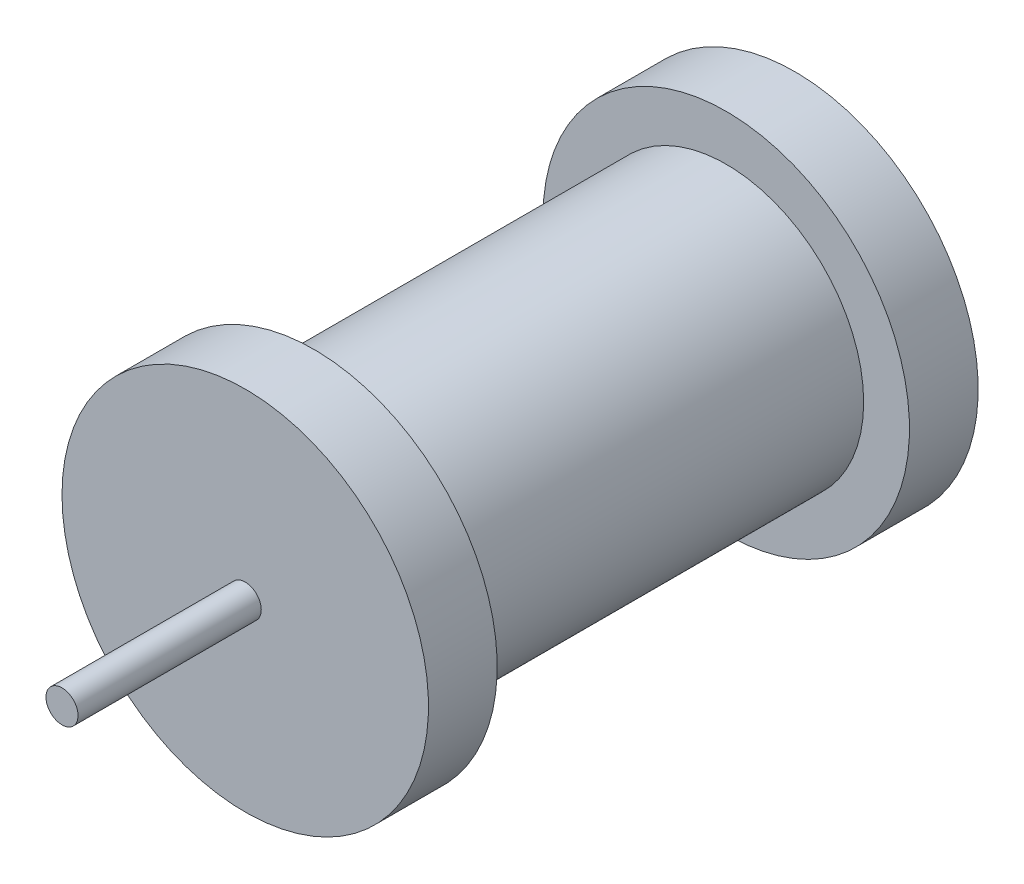
ISO-10303-21;
HEADER;
FILE_DESCRIPTION(('STEP AP214'),'2;1');
FILE_NAME('part.step','',(''),(''),'','','');
FILE_SCHEMA(('AUTOMOTIVE_DESIGN { 1 0 10303 214 1 1 1 1 }'));
ENDSEC;
DATA;
#1=APPLICATION_CONTEXT('core data for automotive mechanical design processes');
#2=APPLICATION_PROTOCOL_DEFINITION('international standard','automotive_design',2000,#1);
#3=PRODUCT_CONTEXT('',#1,'mechanical');
#4=PRODUCT('Part','Part','',(#3));
#5=PRODUCT_RELATED_PRODUCT_CATEGORY('part','',(#4));
#6=PRODUCT_DEFINITION_FORMATION('','',#4);
#7=PRODUCT_DEFINITION_CONTEXT('part definition',#1,'design');
#8=PRODUCT_DEFINITION('design','',#6,#7);
#9=PRODUCT_DEFINITION_SHAPE('','',#8);
#10=(LENGTH_UNIT() NAMED_UNIT(*) SI_UNIT(.MILLI.,.METRE.));
#11=(NAMED_UNIT(*) PLANE_ANGLE_UNIT() SI_UNIT($,.RADIAN.));
#12=(NAMED_UNIT(*) SI_UNIT($,.STERADIAN.) SOLID_ANGLE_UNIT());
#13=UNCERTAINTY_MEASURE_WITH_UNIT(LENGTH_MEASURE(1.E-05),#10,'distance_accuracy_value','');
#14=(GEOMETRIC_REPRESENTATION_CONTEXT(3) GLOBAL_UNCERTAINTY_ASSIGNED_CONTEXT((#13)) GLOBAL_UNIT_ASSIGNED_CONTEXT((#10,
#11,#12)) REPRESENTATION_CONTEXT('',''));
#15=CARTESIAN_POINT('',(0.,0.,0.));
#16=DIRECTION('',(0.,0.,1.));
#17=DIRECTION('',(1.,0.,0.));
#18=AXIS2_PLACEMENT_3D('',#15,#16,#17);
#19=CARTESIAN_POINT('',(0.,0.,50.));
#20=DIRECTION('',(0.,0.,1.));
#21=DIRECTION('',(1.,0.,0.));
#22=AXIS2_PLACEMENT_3D('',#19,#20,#21);
#23=PLANE('',#22);
#24=CARTESIAN_POINT('',(0.,0.,50.));
#25=DIRECTION('',(0.,0.,1.));
#26=DIRECTION('',(1.,0.,0.));
#27=AXIS2_PLACEMENT_3D('',#24,#25,#26);
#28=CIRCLE('',#27,1.75);
#29=CARTESIAN_POINT('',(1.75,0.,50.));
#30=VERTEX_POINT('',#29);
#31=EDGE_CURVE('E11',#30,#30,#28,.T.);
#32=ORIENTED_EDGE('',*,*,#31,.T.);
#33=EDGE_LOOP('',(#32));
#34=FACE_BOUND('',#33,.T.);
#35=ADVANCED_FACE('F43',(#34),#23,.T.);
#36=CARTESIAN_POINT('',(0.,0.,8.04066543438078));
#37=DIRECTION('',(0.,0.,1.));
#38=DIRECTION('',(1.,0.,0.));
#39=AXIS2_PLACEMENT_3D('',#36,#37,#38);
#40=CYLINDRICAL_SURFACE('',#39,1.75);
#41=CARTESIAN_POINT('',(0.,0.,30.));
#42=DIRECTION('',(0.,0.,1.));
#43=DIRECTION('',(1.,0.,0.));
#44=AXIS2_PLACEMENT_3D('',#41,#42,#43);
#45=CIRCLE('',#44,1.75);
#46=CARTESIAN_POINT('',(1.75,0.,30.));
#47=VERTEX_POINT('',#46);
#48=EDGE_CURVE('E49',#47,#47,#45,.T.);
#49=ORIENTED_EDGE('',*,*,#48,.T.);
#50=EDGE_LOOP('',(#49));
#51=FACE_BOUND('',#50,.T.);
#52=ORIENTED_EDGE('',*,*,#31,.F.);
#53=EDGE_LOOP('',(#52));
#54=FACE_BOUND('',#53,.T.);
#55=ADVANCED_FACE('F55',(#51,#54),#40,.T.);
#56=CARTESIAN_POINT('',(1.75,0.,30.));
#57=DIRECTION('',(0.,0.,-1.));
#58=DIRECTION('',(-1.,0.,0.));
#59=AXIS2_PLACEMENT_3D('',#56,#57,#58);
#60=PLANE('',#59);
#61=ORIENTED_EDGE('',*,*,#48,.F.);
#62=EDGE_LOOP('',(#61));
#63=FACE_BOUND('',#62,.T.);
#64=ADVANCED_FACE('F58',(#63),#60,.T.);
#65=CLOSED_SHELL('',(#35,#55,#64));
#66=MANIFOLD_SOLID_BREP('B2',#65);
#67=CARTESIAN_POINT('',(0.,0.,-30.));
#68=DIRECTION('',(0.,0.,-1.));
#69=DIRECTION('',(-1.,0.,0.));
#70=AXIS2_PLACEMENT_3D('',#67,#68,#69);
#71=CYLINDRICAL_SURFACE('',#70,20.);
#72=CARTESIAN_POINT('',(0.,0.,22.5));
#73=DIRECTION('',(0.,0.,-1.));
#74=DIRECTION('',(-1.,0.,0.));
#75=AXIS2_PLACEMENT_3D('',#72,#73,#74);
#76=CIRCLE('',#75,20.);
#77=CARTESIAN_POINT('',(-20.,0.,22.5));
#78=VERTEX_POINT('',#77);
#79=EDGE_CURVE('E89',#78,#78,#76,.T.);
#80=ORIENTED_EDGE('',*,*,#79,.F.);
#81=EDGE_LOOP('',(#80));
#82=FACE_BOUND('',#81,.T.);
#83=CARTESIAN_POINT('',(0.,0.,30.));
#84=DIRECTION('',(0.,0.,-1.));
#85=DIRECTION('',(-1.,0.,0.));
#86=AXIS2_PLACEMENT_3D('',#83,#84,#85);
#87=CIRCLE('',#86,20.);
#88=CARTESIAN_POINT('',(-20.,0.,30.));
#89=VERTEX_POINT('',#88);
#90=EDGE_CURVE('E42',#89,#89,#87,.T.);
#91=ORIENTED_EDGE('',*,*,#90,.T.);
#92=EDGE_LOOP('',(#91));
#93=FACE_BOUND('',#92,.T.);
#94=ADVANCED_FACE('F83',(#82,#93),#71,.T.);
#95=CARTESIAN_POINT('',(20.,0.,22.5));
#96=DIRECTION('',(0.,0.,1.));
#97=DIRECTION('',(1.,0.,0.));
#98=AXIS2_PLACEMENT_3D('',#95,#96,#97);
#99=PLANE('',#98);
#100=CARTESIAN_POINT('',(0.,0.,22.5));
#101=DIRECTION('',(0.,0.,-1.));
#102=DIRECTION('',(-1.,0.,0.));
#103=AXIS2_PLACEMENT_3D('',#100,#101,#102);
#104=CIRCLE('',#103,15.);
#105=CARTESIAN_POINT('',(-15.,0.,22.5));
#106=VERTEX_POINT('',#105);
#107=EDGE_CURVE('E93',#106,#106,#104,.T.);
#108=ORIENTED_EDGE('',*,*,#107,.F.);
#109=EDGE_LOOP('',(#108));
#110=FACE_BOUND('',#109,.T.);
#111=ORIENTED_EDGE('',*,*,#79,.T.);
#112=EDGE_LOOP('',(#111));
#113=FACE_BOUND('',#112,.T.);
#114=ADVANCED_FACE('F126',(#110,#113),#99,.F.);
#115=CARTESIAN_POINT('',(0.,0.,-30.));
#116=DIRECTION('',(0.,0.,-1.));
#117=DIRECTION('',(-1.,0.,0.));
#118=AXIS2_PLACEMENT_3D('',#115,#116,#117);
#119=CYLINDRICAL_SURFACE('',#118,15.);
#120=CARTESIAN_POINT('',(0.,0.,-22.5));
#121=DIRECTION('',(0.,0.,-1.));
#122=DIRECTION('',(-1.,0.,0.));
#123=AXIS2_PLACEMENT_3D('',#120,#121,#122);
#124=CIRCLE('',#123,15.);
#125=CARTESIAN_POINT('',(-15.,0.,-22.5));
#126=VERTEX_POINT('',#125);
#127=EDGE_CURVE('E97',#126,#126,#124,.T.);
#128=ORIENTED_EDGE('',*,*,#127,.F.);
#129=EDGE_LOOP('',(#128));
#130=FACE_BOUND('',#129,.T.);
#131=ORIENTED_EDGE('',*,*,#107,.T.);
#132=EDGE_LOOP('',(#131));
#133=FACE_BOUND('',#132,.T.);
#134=ADVANCED_FACE('F120',(#130,#133),#119,.T.);
#135=CARTESIAN_POINT('',(20.,0.,-22.5));
#136=DIRECTION('',(0.,0.,-1.));
#137=DIRECTION('',(-1.,0.,0.));
#138=AXIS2_PLACEMENT_3D('',#135,#136,#137);
#139=PLANE('',#138);
#140=CARTESIAN_POINT('',(0.,0.,-22.5));
#141=DIRECTION('',(0.,0.,-1.));
#142=DIRECTION('',(-1.,0.,0.));
#143=AXIS2_PLACEMENT_3D('',#140,#141,#142);
#144=CIRCLE('',#143,20.);
#145=CARTESIAN_POINT('',(-20.,0.,-22.5));
#146=VERTEX_POINT('',#145);
#147=EDGE_CURVE('E102',#146,#146,#144,.T.);
#148=ORIENTED_EDGE('',*,*,#147,.F.);
#149=EDGE_LOOP('',(#148));
#150=FACE_BOUND('',#149,.T.);
#151=ORIENTED_EDGE('',*,*,#127,.T.);
#152=EDGE_LOOP('',(#151));
#153=FACE_BOUND('',#152,.T.);
#154=ADVANCED_FACE('F114',(#150,#153),#139,.F.);
#155=CARTESIAN_POINT('',(0.,0.,-30.));
#156=DIRECTION('',(0.,0.,-1.));
#157=DIRECTION('',(-1.,0.,0.));
#158=AXIS2_PLACEMENT_3D('',#155,#156,#157);
#159=CYLINDRICAL_SURFACE('',#158,20.);
#160=CARTESIAN_POINT('',(0.,0.,-30.));
#161=DIRECTION('',(0.,0.,-1.));
#162=DIRECTION('',(-1.,0.,0.));
#163=AXIS2_PLACEMENT_3D('',#160,#161,#162);
#164=CIRCLE('',#163,20.);
#165=CARTESIAN_POINT('',(-20.,0.,-30.));
#166=VERTEX_POINT('',#165);
#167=EDGE_CURVE('E105',#166,#166,#164,.T.);
#168=ORIENTED_EDGE('',*,*,#167,.F.);
#169=EDGE_LOOP('',(#168));
#170=FACE_BOUND('',#169,.T.);
#171=ORIENTED_EDGE('',*,*,#147,.T.);
#172=EDGE_LOOP('',(#171));
#173=FACE_BOUND('',#172,.T.);
#174=ADVANCED_FACE('F111',(#170,#173),#159,.T.);
#175=CARTESIAN_POINT('',(15.,0.,-30.));
#176=DIRECTION('',(0.,0.,1.));
#177=DIRECTION('',(1.,0.,0.));
#178=AXIS2_PLACEMENT_3D('',#175,#176,#177);
#179=PLANE('',#178);
#180=ORIENTED_EDGE('',*,*,#167,.T.);
#181=EDGE_LOOP('',(#180));
#182=FACE_BOUND('',#181,.T.);
#183=ADVANCED_FACE('F109',(#182),#179,.F.);
#184=CARTESIAN_POINT('',(15.,0.,30.));
#185=DIRECTION('',(0.,0.,-1.));
#186=DIRECTION('',(-1.,0.,0.));
#187=AXIS2_PLACEMENT_3D('',#184,#185,#186);
#188=PLANE('',#187);
#189=ORIENTED_EDGE('',*,*,#90,.F.);
#190=EDGE_LOOP('',(#189));
#191=FACE_BOUND('',#190,.T.);
#192=ADVANCED_FACE('F139',(#191),#188,.F.);
#193=CLOSED_SHELL('',(#94,#114,#134,#154,#174,#183,#192));
#194=MANIFOLD_SOLID_BREP('B6',#193);
#195=ADVANCED_BREP_SHAPE_REPRESENTATION('',(#18,#66,#194),#14);
#196=SHAPE_DEFINITION_REPRESENTATION(#9,#195);
ENDSEC;
END-ISO-10303-21;
